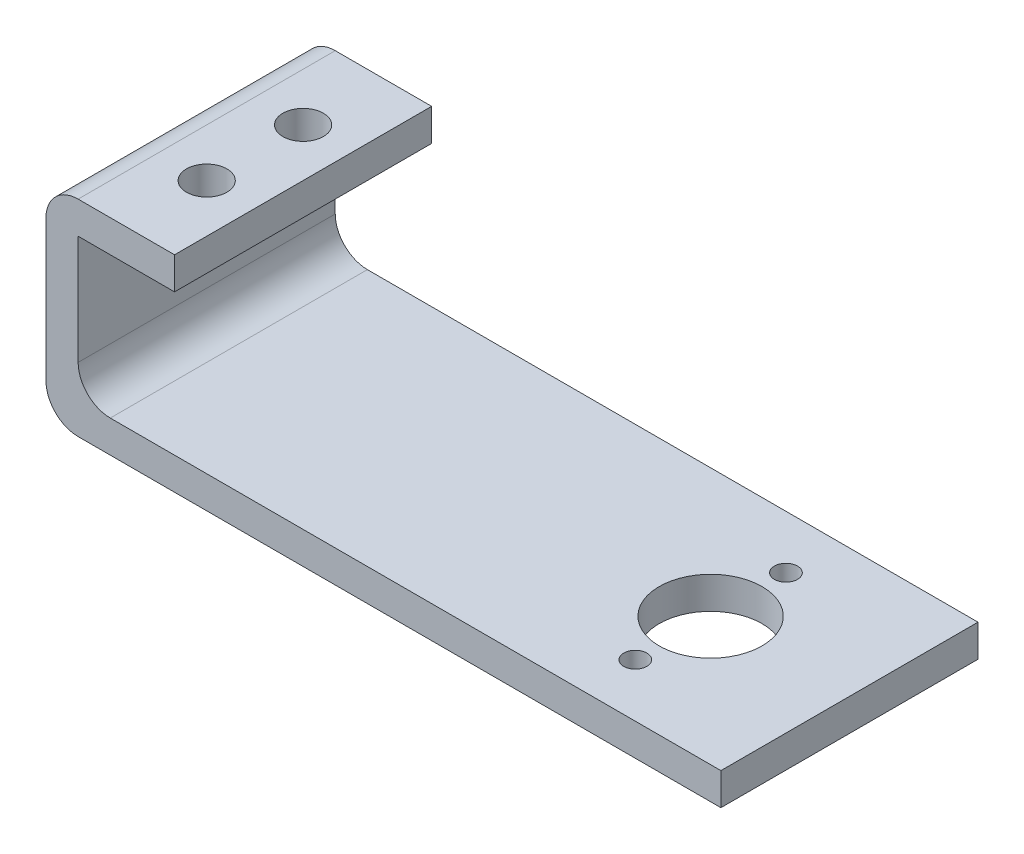
ISO-10303-21;
HEADER;
FILE_DESCRIPTION(('STEP AP214'),'2;1');
FILE_NAME('part.step','',(''),(''),'','','');
FILE_SCHEMA(('AUTOMOTIVE_DESIGN { 1 0 10303 214 1 1 1 1 }'));
ENDSEC;
DATA;
#1=APPLICATION_CONTEXT('core data for automotive mechanical design processes');
#2=APPLICATION_PROTOCOL_DEFINITION('international standard','automotive_design',2000,#1);
#3=PRODUCT_CONTEXT('',#1,'mechanical');
#4=PRODUCT('Part','Part','',(#3));
#5=PRODUCT_RELATED_PRODUCT_CATEGORY('part','',(#4));
#6=PRODUCT_DEFINITION_FORMATION('','',#4);
#7=PRODUCT_DEFINITION_CONTEXT('part definition',#1,'design');
#8=PRODUCT_DEFINITION('design','',#6,#7);
#9=PRODUCT_DEFINITION_SHAPE('','',#8);
#10=(LENGTH_UNIT() NAMED_UNIT(*) SI_UNIT(.MILLI.,.METRE.));
#11=(NAMED_UNIT(*) PLANE_ANGLE_UNIT() SI_UNIT($,.RADIAN.));
#12=(NAMED_UNIT(*) SI_UNIT($,.STERADIAN.) SOLID_ANGLE_UNIT());
#13=UNCERTAINTY_MEASURE_WITH_UNIT(LENGTH_MEASURE(1.E-05),#10,'distance_accuracy_value','');
#14=(GEOMETRIC_REPRESENTATION_CONTEXT(3) GLOBAL_UNCERTAINTY_ASSIGNED_CONTEXT((#13)) GLOBAL_UNIT_ASSIGNED_CONTEXT((#10,
#11,#12)) REPRESENTATION_CONTEXT('',''));
#15=CARTESIAN_POINT('',(0.,0.,0.));
#16=DIRECTION('',(0.,0.,1.));
#17=DIRECTION('',(1.,0.,0.));
#18=AXIS2_PLACEMENT_3D('',#15,#16,#17);
#19=CARTESIAN_POINT('',(-17.0592750793869,-16.2689001518576,25.4));
#20=DIRECTION('',(-1.,0.,0.));
#21=DIRECTION('',(0.,0.,1.));
#22=AXIS2_PLACEMENT_3D('',#19,#20,#21);
#23=PLANE('',#22);
#24=DIRECTION('',(0.,1.,0.));
#25=VECTOR('',#24,1.);
#26=CARTESIAN_POINT('',(-17.0592750793869,-16.2689001518576,0.));
#27=LINE('',#26,#25);
#28=CARTESIAN_POINT('',(-17.0592750793869,-19.4439001518576,0.));
#29=VERTEX_POINT('',#28);
#30=CARTESIAN_POINT('',(-17.0592750793869,-16.2689001518576,0.));
#31=VERTEX_POINT('',#30);
#32=EDGE_CURVE('E139',#29,#31,#27,.T.);
#33=ORIENTED_EDGE('',*,*,#32,.T.);
#34=DIRECTION('',(0.,0.,-1.));
#35=VECTOR('',#34,1.);
#36=CARTESIAN_POINT('',(-17.0592750793869,-16.2689001518576,25.4));
#37=LINE('',#36,#35);
#38=CARTESIAN_POINT('',(-17.0592750793869,-16.2689001518576,25.4));
#39=VERTEX_POINT('',#38);
#40=EDGE_CURVE('E121',#39,#31,#37,.T.);
#41=ORIENTED_EDGE('',*,*,#40,.F.);
#42=DIRECTION('',(0.,1.,0.));
#43=VECTOR('',#42,1.);
#44=CARTESIAN_POINT('',(-17.0592750793869,-16.2689001518576,25.4));
#45=LINE('',#44,#43);
#46=CARTESIAN_POINT('',(-17.0592750793869,-19.4439001518576,25.4));
#47=VERTEX_POINT('',#46);
#48=EDGE_CURVE('E127',#47,#39,#45,.T.);
#49=ORIENTED_EDGE('',*,*,#48,.F.);
#50=DIRECTION('',(0.,0.,-1.));
#51=VECTOR('',#50,1.);
#52=CARTESIAN_POINT('',(-17.0592750793869,-19.4439001518576,25.4));
#53=LINE('',#52,#51);
#54=EDGE_CURVE('E192',#47,#29,#53,.T.);
#55=ORIENTED_EDGE('',*,*,#54,.T.);
#56=EDGE_LOOP('',(#33,#41,#49,#55));
#57=FACE_BOUND('',#56,.T.);
#58=ADVANCED_FACE('F33',(#57),#23,.F.);
#59=CARTESIAN_POINT('',(-17.0592750793869,-16.2689001518576,25.4));
#60=DIRECTION('',(0.,-1.,0.));
#61=DIRECTION('',(1.,0.,0.));
#62=AXIS2_PLACEMENT_3D('',#59,#60,#61);
#63=PLANE('',#62);
#64=CARTESIAN_POINT('',(-21.8217750793869,-16.2689001518576,7.9375));
#65=DIRECTION('',(0.,1.,0.));
#66=DIRECTION('',(0.,0.,1.));
#67=AXIS2_PLACEMENT_3D('',#64,#65,#66);
#68=CIRCLE('',#67,2.);
#69=CARTESIAN_POINT('',(-21.8217750793869,-16.2689001518576,9.9375));
#70=VERTEX_POINT('',#69);
#71=EDGE_CURVE('E407',#70,#70,#68,.T.);
#72=ORIENTED_EDGE('',*,*,#71,.F.);
#73=EDGE_LOOP('',(#72));
#74=FACE_BOUND('',#73,.T.);
#75=CARTESIAN_POINT('',(-21.8217750793869,-16.2689001518576,17.4625));
#76=DIRECTION('',(0.,1.,0.));
#77=DIRECTION('',(0.,0.,1.));
#78=AXIS2_PLACEMENT_3D('',#75,#76,#77);
#79=CIRCLE('',#78,2.);
#80=CARTESIAN_POINT('',(-21.8217750793869,-16.2689001518576,19.4625));
#81=VERTEX_POINT('',#80);
#82=EDGE_CURVE('E418',#81,#81,#79,.T.);
#83=ORIENTED_EDGE('',*,*,#82,.F.);
#84=EDGE_LOOP('',(#83));
#85=FACE_BOUND('',#84,.T.);
#86=DIRECTION('',(-1.,0.,0.));
#87=VECTOR('',#86,1.);
#88=CARTESIAN_POINT('',(-17.0592750793869,-16.2689001518576,0.));
#89=LINE('',#88,#87);
#90=CARTESIAN_POINT('',(-26.5842750793869,-16.2689001518576,0.));
#91=VERTEX_POINT('',#90);
#92=EDGE_CURVE('E199',#31,#91,#89,.T.);
#93=ORIENTED_EDGE('',*,*,#92,.T.);
#94=DIRECTION('',(0.,0.,-1.));
#95=VECTOR('',#94,1.);
#96=CARTESIAN_POINT('',(-26.5842750793869,-16.2689001518576,25.4));
#97=LINE('',#96,#95);
#98=CARTESIAN_POINT('',(-26.5842750793869,-16.2689001518576,25.4));
#99=VERTEX_POINT('',#98);
#100=EDGE_CURVE('E124',#91,#99,#97,.F.);
#101=ORIENTED_EDGE('',*,*,#100,.T.);
#102=DIRECTION('',(-1.,0.,0.));
#103=VECTOR('',#102,1.);
#104=CARTESIAN_POINT('',(-17.0592750793869,-16.2689001518576,25.4));
#105=LINE('',#104,#103);
#106=EDGE_CURVE('E116',#39,#99,#105,.T.);
#107=ORIENTED_EDGE('',*,*,#106,.F.);
#108=ORIENTED_EDGE('',*,*,#40,.T.);
#109=EDGE_LOOP('',(#93,#101,#107,#108));
#110=FACE_BOUND('',#109,.T.);
#111=ADVANCED_FACE('F119',(#74,#85,#110),#63,.F.);
#112=CARTESIAN_POINT('',(-29.7592750793869,-16.2689001518576,25.4));
#113=DIRECTION('',(1.,0.,0.));
#114=DIRECTION('',(0.,1.,0.));
#115=AXIS2_PLACEMENT_3D('',#112,#113,#114);
#116=PLANE('',#115);
#117=DIRECTION('',(0.,-1.,0.));
#118=VECTOR('',#117,1.);
#119=CARTESIAN_POINT('',(-29.7592750793869,-16.2689001518576,25.4));
#120=LINE('',#119,#118);
#121=CARTESIAN_POINT('',(-29.7592750793869,-19.4439001518576,25.4));
#122=VERTEX_POINT('',#121);
#123=CARTESIAN_POINT('',(-29.7592750793869,-33.4139001518576,25.4));
#124=VERTEX_POINT('',#123);
#125=EDGE_CURVE('E126',#122,#124,#120,.T.);
#126=ORIENTED_EDGE('',*,*,#125,.F.);
#127=DIRECTION('',(0.,0.,-1.));
#128=VECTOR('',#127,1.);
#129=CARTESIAN_POINT('',(-29.7592750793869,-19.4439001518576,25.4));
#130=LINE('',#129,#128);
#131=CARTESIAN_POINT('',(-29.7592750793869,-19.4439001518576,0.));
#132=VERTEX_POINT('',#131);
#133=EDGE_CURVE('E143',#122,#132,#130,.T.);
#134=ORIENTED_EDGE('',*,*,#133,.T.);
#135=DIRECTION('',(0.,-1.,0.));
#136=VECTOR('',#135,1.);
#137=CARTESIAN_POINT('',(-29.7592750793869,-16.2689001518576,0.));
#138=LINE('',#137,#136);
#139=CARTESIAN_POINT('',(-29.7592750793869,-33.4139001518576,0.));
#140=VERTEX_POINT('',#139);
#141=EDGE_CURVE('E202',#132,#140,#138,.T.);
#142=ORIENTED_EDGE('',*,*,#141,.T.);
#143=DIRECTION('',(0.,0.,-1.));
#144=VECTOR('',#143,1.);
#145=CARTESIAN_POINT('',(-29.7592750793869,-33.4139001518576,25.4));
#146=LINE('',#145,#144);
#147=EDGE_CURVE('E140',#140,#124,#146,.F.);
#148=ORIENTED_EDGE('',*,*,#147,.T.);
#149=EDGE_LOOP('',(#126,#134,#142,#148));
#150=FACE_BOUND('',#149,.T.);
#151=ADVANCED_FACE('F220',(#150),#116,.F.);
#152=CARTESIAN_POINT('',(-29.7592750793869,-36.5889001518576,25.4));
#153=DIRECTION('',(0.,1.,0.));
#154=DIRECTION('',(0.,0.,1.));
#155=AXIS2_PLACEMENT_3D('',#152,#153,#154);
#156=PLANE('',#155);
#157=CARTESIAN_POINT('',(23.1997249206131,-36.5889001518576,20.1422));
#158=DIRECTION('',(0.,-1.,0.));
#159=DIRECTION('',(0.,0.,-1.));
#160=AXIS2_PLACEMENT_3D('',#157,#158,#159);
#161=CIRCLE('',#160,1.143);
#162=CARTESIAN_POINT('',(23.1997249206131,-36.5889001518576,18.9992));
#163=VERTEX_POINT('',#162);
#164=EDGE_CURVE('E395',#163,#163,#161,.T.);
#165=ORIENTED_EDGE('',*,*,#164,.F.);
#166=EDGE_LOOP('',(#165));
#167=FACE_BOUND('',#166,.T.);
#168=CARTESIAN_POINT('',(23.1997249206131,-36.5889001518576,5.2578));
#169=DIRECTION('',(0.,-1.,0.));
#170=DIRECTION('',(0.,0.,-1.));
#171=AXIS2_PLACEMENT_3D('',#168,#169,#170);
#172=CIRCLE('',#171,1.143);
#173=CARTESIAN_POINT('',(23.1997249206131,-36.5889001518576,4.1148));
#174=VERTEX_POINT('',#173);
#175=EDGE_CURVE('E399',#174,#174,#172,.T.);
#176=ORIENTED_EDGE('',*,*,#175,.F.);
#177=EDGE_LOOP('',(#176));
#178=FACE_BOUND('',#177,.T.);
#179=CARTESIAN_POINT('',(23.1997249206131,-36.5889001518576,12.7));
#180=DIRECTION('',(0.,-1.,0.));
#181=DIRECTION('',(0.,0.,-1.));
#182=AXIS2_PLACEMENT_3D('',#179,#180,#181);
#183=CIRCLE('',#182,5.08);
#184=CARTESIAN_POINT('',(23.1997249206131,-36.5889001518576,7.62));
#185=VERTEX_POINT('',#184);
#186=EDGE_CURVE('E402',#185,#185,#183,.T.);
#187=ORIENTED_EDGE('',*,*,#186,.F.);
#188=EDGE_LOOP('',(#187));
#189=FACE_BOUND('',#188,.T.);
#190=DIRECTION('',(1.,0.,0.));
#191=VECTOR('',#190,1.);
#192=CARTESIAN_POINT('',(-29.7592750793869,-36.5889001518576,25.4));
#193=LINE('',#192,#191);
#194=CARTESIAN_POINT('',(-26.5842750793869,-36.5889001518576,25.4));
#195=VERTEX_POINT('',#194);
#196=CARTESIAN_POINT('',(36.9157249206131,-36.5889001518576,25.4));
#197=VERTEX_POINT('',#196);
#198=EDGE_CURVE('E222',#195,#197,#193,.T.);
#199=ORIENTED_EDGE('',*,*,#198,.F.);
#200=DIRECTION('',(0.,0.,-1.));
#201=VECTOR('',#200,1.);
#202=CARTESIAN_POINT('',(-26.5842750793869,-36.5889001518576,25.4));
#203=LINE('',#202,#201);
#204=CARTESIAN_POINT('',(-26.5842750793869,-36.5889001518576,0.));
#205=VERTEX_POINT('',#204);
#206=EDGE_CURVE('E165',#195,#205,#203,.T.);
#207=ORIENTED_EDGE('',*,*,#206,.T.);
#208=DIRECTION('',(1.,0.,0.));
#209=VECTOR('',#208,1.);
#210=CARTESIAN_POINT('',(-29.7592750793869,-36.5889001518576,0.));
#211=LINE('',#210,#209);
#212=CARTESIAN_POINT('',(36.9157249206131,-36.5889001518576,0.));
#213=VERTEX_POINT('',#212);
#214=EDGE_CURVE('E205',#205,#213,#211,.T.);
#215=ORIENTED_EDGE('',*,*,#214,.T.);
#216=DIRECTION('',(0.,0.,-1.));
#217=VECTOR('',#216,1.);
#218=CARTESIAN_POINT('',(36.9157249206131,-36.5889001518576,25.4));
#219=LINE('',#218,#217);
#220=EDGE_CURVE('E141',#197,#213,#219,.T.);
#221=ORIENTED_EDGE('',*,*,#220,.F.);
#222=EDGE_LOOP('',(#199,#207,#215,#221));
#223=FACE_BOUND('',#222,.T.);
#224=ADVANCED_FACE('F232',(#167,#178,#189,#223),#156,.F.);
#225=CARTESIAN_POINT('',(36.9157249206131,-36.5889001518576,25.4));
#226=DIRECTION('',(-1.,0.,0.));
#227=DIRECTION('',(0.,0.,1.));
#228=AXIS2_PLACEMENT_3D('',#225,#226,#227);
#229=PLANE('',#228);
#230=DIRECTION('',(0.,1.,0.));
#231=VECTOR('',#230,1.);
#232=CARTESIAN_POINT('',(36.9157249206131,-36.5889001518576,0.));
#233=LINE('',#232,#231);
#234=CARTESIAN_POINT('',(36.9157249206131,-33.4139001518576,0.));
#235=VERTEX_POINT('',#234);
#236=EDGE_CURVE('E181',#213,#235,#233,.T.);
#237=ORIENTED_EDGE('',*,*,#236,.T.);
#238=DIRECTION('',(0.,0.,-1.));
#239=VECTOR('',#238,1.);
#240=CARTESIAN_POINT('',(36.9157249206131,-33.4139001518576,25.4));
#241=LINE('',#240,#239);
#242=CARTESIAN_POINT('',(36.9157249206131,-33.4139001518576,25.4));
#243=VERTEX_POINT('',#242);
#244=EDGE_CURVE('E146',#243,#235,#241,.T.);
#245=ORIENTED_EDGE('',*,*,#244,.F.);
#246=DIRECTION('',(0.,1.,0.));
#247=VECTOR('',#246,1.);
#248=CARTESIAN_POINT('',(36.9157249206131,-36.5889001518576,25.4));
#249=LINE('',#248,#247);
#250=EDGE_CURVE('E194',#197,#243,#249,.T.);
#251=ORIENTED_EDGE('',*,*,#250,.F.);
#252=ORIENTED_EDGE('',*,*,#220,.T.);
#253=EDGE_LOOP('',(#237,#245,#251,#252));
#254=FACE_BOUND('',#253,.T.);
#255=ADVANCED_FACE('F229',(#254),#229,.F.);
#256=CARTESIAN_POINT('',(-26.5842750793869,-33.4139001518576,25.4));
#257=DIRECTION('',(0.,-1.,0.));
#258=DIRECTION('',(0.,0.,-1.));
#259=AXIS2_PLACEMENT_3D('',#256,#257,#258);
#260=PLANE('',#259);
#261=CARTESIAN_POINT('',(23.1997249206131,-33.4139001518576,20.1422));
#262=DIRECTION('',(0.,-1.,0.));
#263=DIRECTION('',(0.,0.,-1.));
#264=AXIS2_PLACEMENT_3D('',#261,#262,#263);
#265=CIRCLE('',#264,1.143);
#266=CARTESIAN_POINT('',(23.1997249206131,-33.4139001518576,18.9992));
#267=VERTEX_POINT('',#266);
#268=EDGE_CURVE('E431',#267,#267,#265,.F.);
#269=ORIENTED_EDGE('',*,*,#268,.F.);
#270=EDGE_LOOP('',(#269));
#271=FACE_BOUND('',#270,.T.);
#272=CARTESIAN_POINT('',(23.1997249206131,-33.4139001518576,5.2578));
#273=DIRECTION('',(0.,-1.,0.));
#274=DIRECTION('',(0.,0.,-1.));
#275=AXIS2_PLACEMENT_3D('',#272,#273,#274);
#276=CIRCLE('',#275,1.143);
#277=CARTESIAN_POINT('',(23.1997249206131,-33.4139001518576,4.1148));
#278=VERTEX_POINT('',#277);
#279=EDGE_CURVE('E404',#278,#278,#276,.F.);
#280=ORIENTED_EDGE('',*,*,#279,.F.);
#281=EDGE_LOOP('',(#280));
#282=FACE_BOUND('',#281,.T.);
#283=CARTESIAN_POINT('',(23.1997249206131,-33.4139001518576,12.7));
#284=DIRECTION('',(0.,-1.,0.));
#285=DIRECTION('',(0.,0.,-1.));
#286=AXIS2_PLACEMENT_3D('',#283,#284,#285);
#287=CIRCLE('',#286,5.08);
#288=CARTESIAN_POINT('',(23.1997249206131,-33.4139001518576,7.62));
#289=VERTEX_POINT('',#288);
#290=EDGE_CURVE('E403',#289,#289,#287,.F.);
#291=ORIENTED_EDGE('',*,*,#290,.F.);
#292=EDGE_LOOP('',(#291));
#293=FACE_BOUND('',#292,.T.);
#294=DIRECTION('',(-1.,0.,0.));
#295=VECTOR('',#294,1.);
#296=CARTESIAN_POINT('',(-26.5842750793869,-33.4139001518576,0.));
#297=LINE('',#296,#295);
#298=CARTESIAN_POINT('',(-23.4092750793869,-33.4139001518576,0.));
#299=VERTEX_POINT('',#298);
#300=EDGE_CURVE('E173',#235,#299,#297,.T.);
#301=ORIENTED_EDGE('',*,*,#300,.T.);
#302=DIRECTION('',(0.,0.,-1.));
#303=VECTOR('',#302,1.);
#304=CARTESIAN_POINT('',(-23.4092750793869,-33.4139001518576,25.4));
#305=LINE('',#304,#303);
#306=CARTESIAN_POINT('',(-23.4092750793869,-33.4139001518576,25.4));
#307=VERTEX_POINT('',#306);
#308=EDGE_CURVE('E54',#299,#307,#305,.F.);
#309=ORIENTED_EDGE('',*,*,#308,.T.);
#310=DIRECTION('',(-1.,0.,0.));
#311=VECTOR('',#310,1.);
#312=CARTESIAN_POINT('',(-26.5842750793869,-33.4139001518576,25.4));
#313=LINE('',#312,#311);
#314=EDGE_CURVE('E190',#243,#307,#313,.T.);
#315=ORIENTED_EDGE('',*,*,#314,.F.);
#316=ORIENTED_EDGE('',*,*,#244,.T.);
#317=EDGE_LOOP('',(#301,#309,#315,#316));
#318=FACE_BOUND('',#317,.T.);
#319=ADVANCED_FACE('F179',(#271,#282,#293,#318),#260,.F.);
#320=CARTESIAN_POINT('',(-26.5842750793869,-19.4439001518576,25.4));
#321=DIRECTION('',(-1.,0.,0.));
#322=DIRECTION('',(0.,0.,1.));
#323=AXIS2_PLACEMENT_3D('',#320,#321,#322);
#324=PLANE('',#323);
#325=DIRECTION('',(0.,1.,0.));
#326=VECTOR('',#325,1.);
#327=CARTESIAN_POINT('',(-26.5842750793869,-19.4439001518576,25.4));
#328=LINE('',#327,#326);
#329=CARTESIAN_POINT('',(-26.5842750793869,-30.2389001518576,25.4));
#330=VERTEX_POINT('',#329);
#331=CARTESIAN_POINT('',(-26.5842750793869,-19.4439001518576,25.4));
#332=VERTEX_POINT('',#331);
#333=EDGE_CURVE('E188',#330,#332,#328,.T.);
#334=ORIENTED_EDGE('',*,*,#333,.F.);
#335=DIRECTION('',(0.,0.,-1.));
#336=VECTOR('',#335,1.);
#337=CARTESIAN_POINT('',(-26.5842750793869,-30.2389001518576,0.));
#338=LINE('',#337,#336);
#339=CARTESIAN_POINT('',(-26.5842750793869,-30.2389001518576,0.));
#340=VERTEX_POINT('',#339);
#341=EDGE_CURVE('E161',#330,#340,#338,.T.);
#342=ORIENTED_EDGE('',*,*,#341,.T.);
#343=DIRECTION('',(0.,1.,0.));
#344=VECTOR('',#343,1.);
#345=CARTESIAN_POINT('',(-26.5842750793869,-19.4439001518576,0.));
#346=LINE('',#345,#344);
#347=CARTESIAN_POINT('',(-26.5842750793869,-19.4439001518576,0.));
#348=VERTEX_POINT('',#347);
#349=EDGE_CURVE('E175',#340,#348,#346,.T.);
#350=ORIENTED_EDGE('',*,*,#349,.T.);
#351=DIRECTION('',(0.,0.,-1.));
#352=VECTOR('',#351,1.);
#353=CARTESIAN_POINT('',(-26.5842750793869,-19.4439001518576,25.4));
#354=LINE('',#353,#352);
#355=EDGE_CURVE('E189',#332,#348,#354,.T.);
#356=ORIENTED_EDGE('',*,*,#355,.F.);
#357=EDGE_LOOP('',(#334,#342,#350,#356));
#358=FACE_BOUND('',#357,.T.);
#359=ADVANCED_FACE('F185',(#358),#324,.F.);
#360=CARTESIAN_POINT('',(-17.0592750793869,-19.4439001518576,25.4));
#361=DIRECTION('',(0.,1.,0.));
#362=DIRECTION('',(0.,0.,1.));
#363=AXIS2_PLACEMENT_3D('',#360,#361,#362);
#364=PLANE('',#363);
#365=CARTESIAN_POINT('',(-21.8217750793869,-19.4439001518576,7.9375));
#366=DIRECTION('',(0.,1.,0.));
#367=DIRECTION('',(0.,0.,1.));
#368=AXIS2_PLACEMENT_3D('',#365,#366,#367);
#369=CIRCLE('',#368,2.);
#370=CARTESIAN_POINT('',(-21.8217750793869,-19.4439001518576,9.9375));
#371=VERTEX_POINT('',#370);
#372=EDGE_CURVE('E415',#371,#371,#369,.T.);
#373=ORIENTED_EDGE('',*,*,#372,.T.);
#374=EDGE_LOOP('',(#373));
#375=FACE_BOUND('',#374,.T.);
#376=CARTESIAN_POINT('',(-21.8217750793869,-19.4439001518576,17.4625));
#377=DIRECTION('',(0.,1.,0.));
#378=DIRECTION('',(0.,0.,1.));
#379=AXIS2_PLACEMENT_3D('',#376,#377,#378);
#380=CIRCLE('',#379,2.);
#381=CARTESIAN_POINT('',(-21.8217750793869,-19.4439001518576,19.4625));
#382=VERTEX_POINT('',#381);
#383=EDGE_CURVE('E200',#382,#382,#380,.T.);
#384=ORIENTED_EDGE('',*,*,#383,.T.);
#385=EDGE_LOOP('',(#384));
#386=FACE_BOUND('',#385,.T.);
#387=DIRECTION('',(1.,0.,0.));
#388=VECTOR('',#387,1.);
#389=CARTESIAN_POINT('',(-17.0592750793869,-19.4439001518576,0.));
#390=LINE('',#389,#388);
#391=EDGE_CURVE('E136',#348,#29,#390,.T.);
#392=ORIENTED_EDGE('',*,*,#391,.T.);
#393=ORIENTED_EDGE('',*,*,#54,.F.);
#394=DIRECTION('',(1.,0.,0.));
#395=VECTOR('',#394,1.);
#396=CARTESIAN_POINT('',(-17.0592750793869,-19.4439001518576,25.4));
#397=LINE('',#396,#395);
#398=EDGE_CURVE('E132',#332,#47,#397,.T.);
#399=ORIENTED_EDGE('',*,*,#398,.F.);
#400=ORIENTED_EDGE('',*,*,#355,.T.);
#401=EDGE_LOOP('',(#392,#393,#399,#400));
#402=FACE_BOUND('',#401,.T.);
#403=ADVANCED_FACE('F212',(#375,#386,#402),#364,.F.);
#404=CARTESIAN_POINT('',(0.,0.,25.4));
#405=DIRECTION('',(0.,0.,-1.));
#406=DIRECTION('',(-1.,0.,0.));
#407=AXIS2_PLACEMENT_3D('',#404,#405,#406);
#408=PLANE('',#407);
#409=ORIENTED_EDGE('',*,*,#106,.T.);
#410=CARTESIAN_POINT('',(-26.5842750793869,-19.4439001518576,25.4));
#411=DIRECTION('',(0.,0.,-1.));
#412=DIRECTION('',(-1.,0.,0.));
#413=AXIS2_PLACEMENT_3D('',#410,#411,#412);
#414=CIRCLE('',#413,3.175);
#415=EDGE_CURVE('E159',#99,#122,#414,.F.);
#416=ORIENTED_EDGE('',*,*,#415,.T.);
#417=ORIENTED_EDGE('',*,*,#125,.T.);
#418=CARTESIAN_POINT('',(-26.5842750793869,-33.4139001518576,25.4));
#419=DIRECTION('',(0.,0.,-1.));
#420=DIRECTION('',(-1.,0.,0.));
#421=AXIS2_PLACEMENT_3D('',#418,#419,#420);
#422=CIRCLE('',#421,3.175);
#423=EDGE_CURVE('E157',#124,#195,#422,.F.);
#424=ORIENTED_EDGE('',*,*,#423,.T.);
#425=ORIENTED_EDGE('',*,*,#198,.T.);
#426=ORIENTED_EDGE('',*,*,#250,.T.);
#427=ORIENTED_EDGE('',*,*,#314,.T.);
#428=CARTESIAN_POINT('',(-23.4092750793869,-30.2389001518576,25.4));
#429=DIRECTION('',(0.,0.,-1.));
#430=DIRECTION('',(-1.,0.,0.));
#431=AXIS2_PLACEMENT_3D('',#428,#429,#430);
#432=CIRCLE('',#431,3.175);
#433=EDGE_CURVE('E11',#307,#330,#432,.T.);
#434=ORIENTED_EDGE('',*,*,#433,.T.);
#435=ORIENTED_EDGE('',*,*,#333,.T.);
#436=ORIENTED_EDGE('',*,*,#398,.T.);
#437=ORIENTED_EDGE('',*,*,#48,.T.);
#438=EDGE_LOOP('',(#409,#416,#417,#424,#425,#426,#427,#434,#435,#436,#437));
#439=FACE_BOUND('',#438,.T.);
#440=ADVANCED_FACE('F130',(#439),#408,.F.);
#441=CARTESIAN_POINT('',(0.,0.,0.));
#442=DIRECTION('',(0.,0.,-1.));
#443=DIRECTION('',(-1.,0.,0.));
#444=AXIS2_PLACEMENT_3D('',#441,#442,#443);
#445=PLANE('',#444);
#446=ORIENTED_EDGE('',*,*,#141,.F.);
#447=CARTESIAN_POINT('',(-26.5842750793869,-19.4439001518576,0.));
#448=DIRECTION('',(0.,0.,-1.));
#449=DIRECTION('',(-1.,0.,0.));
#450=AXIS2_PLACEMENT_3D('',#447,#448,#449);
#451=CIRCLE('',#450,3.175);
#452=EDGE_CURVE('E154',#132,#91,#451,.T.);
#453=ORIENTED_EDGE('',*,*,#452,.T.);
#454=ORIENTED_EDGE('',*,*,#92,.F.);
#455=ORIENTED_EDGE('',*,*,#32,.F.);
#456=ORIENTED_EDGE('',*,*,#391,.F.);
#457=ORIENTED_EDGE('',*,*,#349,.F.);
#458=CARTESIAN_POINT('',(-23.4092750793869,-30.2389001518576,0.));
#459=DIRECTION('',(0.,0.,-1.));
#460=DIRECTION('',(-1.,0.,0.));
#461=AXIS2_PLACEMENT_3D('',#458,#459,#460);
#462=CIRCLE('',#461,3.175);
#463=EDGE_CURVE('E41',#340,#299,#462,.F.);
#464=ORIENTED_EDGE('',*,*,#463,.T.);
#465=ORIENTED_EDGE('',*,*,#300,.F.);
#466=ORIENTED_EDGE('',*,*,#236,.F.);
#467=ORIENTED_EDGE('',*,*,#214,.F.);
#468=CARTESIAN_POINT('',(-26.5842750793869,-33.4139001518576,0.));
#469=DIRECTION('',(0.,0.,-1.));
#470=DIRECTION('',(-1.,0.,0.));
#471=AXIS2_PLACEMENT_3D('',#468,#469,#470);
#472=CIRCLE('',#471,3.175);
#473=EDGE_CURVE('E152',#205,#140,#472,.T.);
#474=ORIENTED_EDGE('',*,*,#473,.T.);
#475=EDGE_LOOP('',(#446,#453,#454,#455,#456,#457,#464,#465,#466,#467,#474));
#476=FACE_BOUND('',#475,.T.);
#477=ADVANCED_FACE('F171',(#476),#445,.T.);
#478=CARTESIAN_POINT('',(-21.8217750793869,-16.2689001518576,17.4625));
#479=DIRECTION('',(0.,1.,0.));
#480=DIRECTION('',(0.,0.,1.));
#481=AXIS2_PLACEMENT_3D('',#478,#479,#480);
#482=CYLINDRICAL_SURFACE('',#481,2.);
#483=ORIENTED_EDGE('',*,*,#383,.F.);
#484=EDGE_LOOP('',(#483));
#485=FACE_BOUND('',#484,.T.);
#486=ORIENTED_EDGE('',*,*,#82,.T.);
#487=EDGE_LOOP('',(#486));
#488=FACE_BOUND('',#487,.T.);
#489=ADVANCED_FACE('F271',(#485,#488),#482,.F.);
#490=CARTESIAN_POINT('',(-21.8217750793869,-16.2689001518576,7.9375));
#491=DIRECTION('',(0.,1.,0.));
#492=DIRECTION('',(0.,0.,1.));
#493=AXIS2_PLACEMENT_3D('',#490,#491,#492);
#494=CYLINDRICAL_SURFACE('',#493,2.);
#495=ORIENTED_EDGE('',*,*,#372,.F.);
#496=EDGE_LOOP('',(#495));
#497=FACE_BOUND('',#496,.T.);
#498=ORIENTED_EDGE('',*,*,#71,.T.);
#499=EDGE_LOOP('',(#498));
#500=FACE_BOUND('',#499,.T.);
#501=ADVANCED_FACE('F267',(#497,#500),#494,.F.);
#502=CARTESIAN_POINT('',(23.1997249206131,-16.2679001518576,12.7));
#503=DIRECTION('',(0.,-1.,0.));
#504=DIRECTION('',(0.,0.,-1.));
#505=AXIS2_PLACEMENT_3D('',#502,#503,#504);
#506=CYLINDRICAL_SURFACE('',#505,5.08);
#507=ORIENTED_EDGE('',*,*,#186,.T.);
#508=EDGE_LOOP('',(#507));
#509=FACE_BOUND('',#508,.T.);
#510=ORIENTED_EDGE('',*,*,#290,.T.);
#511=EDGE_LOOP('',(#510));
#512=FACE_BOUND('',#511,.T.);
#513=ADVANCED_FACE('F259',(#509,#512),#506,.F.);
#514=CARTESIAN_POINT('',(23.1997249206131,-16.2679001518576,5.2578));
#515=DIRECTION('',(0.,-1.,0.));
#516=DIRECTION('',(0.,0.,-1.));
#517=AXIS2_PLACEMENT_3D('',#514,#515,#516);
#518=CYLINDRICAL_SURFACE('',#517,1.143);
#519=ORIENTED_EDGE('',*,*,#175,.T.);
#520=EDGE_LOOP('',(#519));
#521=FACE_BOUND('',#520,.T.);
#522=ORIENTED_EDGE('',*,*,#279,.T.);
#523=EDGE_LOOP('',(#522));
#524=FACE_BOUND('',#523,.T.);
#525=ADVANCED_FACE('F253',(#521,#524),#518,.F.);
#526=CARTESIAN_POINT('',(23.1997249206131,-16.2679001518576,20.1422));
#527=DIRECTION('',(0.,-1.,0.));
#528=DIRECTION('',(0.,0.,-1.));
#529=AXIS2_PLACEMENT_3D('',#526,#527,#528);
#530=CYLINDRICAL_SURFACE('',#529,1.143);
#531=ORIENTED_EDGE('',*,*,#164,.T.);
#532=EDGE_LOOP('',(#531));
#533=FACE_BOUND('',#532,.T.);
#534=ORIENTED_EDGE('',*,*,#268,.T.);
#535=EDGE_LOOP('',(#534));
#536=FACE_BOUND('',#535,.T.);
#537=ADVANCED_FACE('F249',(#533,#536),#530,.F.);
#538=CARTESIAN_POINT('',(-26.5842750793869,-19.4439001518576,25.4));
#539=DIRECTION('',(0.,0.,-1.));
#540=DIRECTION('',(-1.,0.,0.));
#541=AXIS2_PLACEMENT_3D('',#538,#539,#540);
#542=CYLINDRICAL_SURFACE('',#541,3.175);
#543=ORIENTED_EDGE('',*,*,#415,.F.);
#544=ORIENTED_EDGE('',*,*,#100,.F.);
#545=ORIENTED_EDGE('',*,*,#452,.F.);
#546=ORIENTED_EDGE('',*,*,#133,.F.);
#547=EDGE_LOOP('',(#543,#544,#545,#546));
#548=FACE_BOUND('',#547,.T.);
#549=ADVANCED_FACE('F214',(#548),#542,.T.);
#550=CARTESIAN_POINT('',(-23.4092750793869,-30.2389001518576,25.4));
#551=DIRECTION('',(0.,0.,1.));
#552=DIRECTION('',(1.,0.,0.));
#553=AXIS2_PLACEMENT_3D('',#550,#551,#552);
#554=CYLINDRICAL_SURFACE('',#553,3.175);
#555=ORIENTED_EDGE('',*,*,#433,.F.);
#556=ORIENTED_EDGE('',*,*,#308,.F.);
#557=ORIENTED_EDGE('',*,*,#463,.F.);
#558=ORIENTED_EDGE('',*,*,#341,.F.);
#559=EDGE_LOOP('',(#555,#556,#557,#558));
#560=FACE_BOUND('',#559,.T.);
#561=ADVANCED_FACE('F183',(#560),#554,.F.);
#562=CARTESIAN_POINT('',(-26.5842750793869,-33.4139001518576,25.4));
#563=DIRECTION('',(0.,0.,-1.));
#564=DIRECTION('',(-1.,0.,0.));
#565=AXIS2_PLACEMENT_3D('',#562,#563,#564);
#566=CYLINDRICAL_SURFACE('',#565,3.175);
#567=ORIENTED_EDGE('',*,*,#423,.F.);
#568=ORIENTED_EDGE('',*,*,#147,.F.);
#569=ORIENTED_EDGE('',*,*,#473,.F.);
#570=ORIENTED_EDGE('',*,*,#206,.F.);
#571=EDGE_LOOP('',(#567,#568,#569,#570));
#572=FACE_BOUND('',#571,.T.);
#573=ADVANCED_FACE('F35',(#572),#566,.T.);
#574=CLOSED_SHELL('',(#58,#111,#151,#224,#255,#319,#359,#403,#440,#477,#489,#501,#513,#525,#537,
#549,#561,#573));
#575=MANIFOLD_SOLID_BREP('B2',#574);
#576=ADVANCED_BREP_SHAPE_REPRESENTATION('',(#18,#575),#14);
#577=SHAPE_DEFINITION_REPRESENTATION(#9,#576);
ENDSEC;
END-ISO-10303-21;
